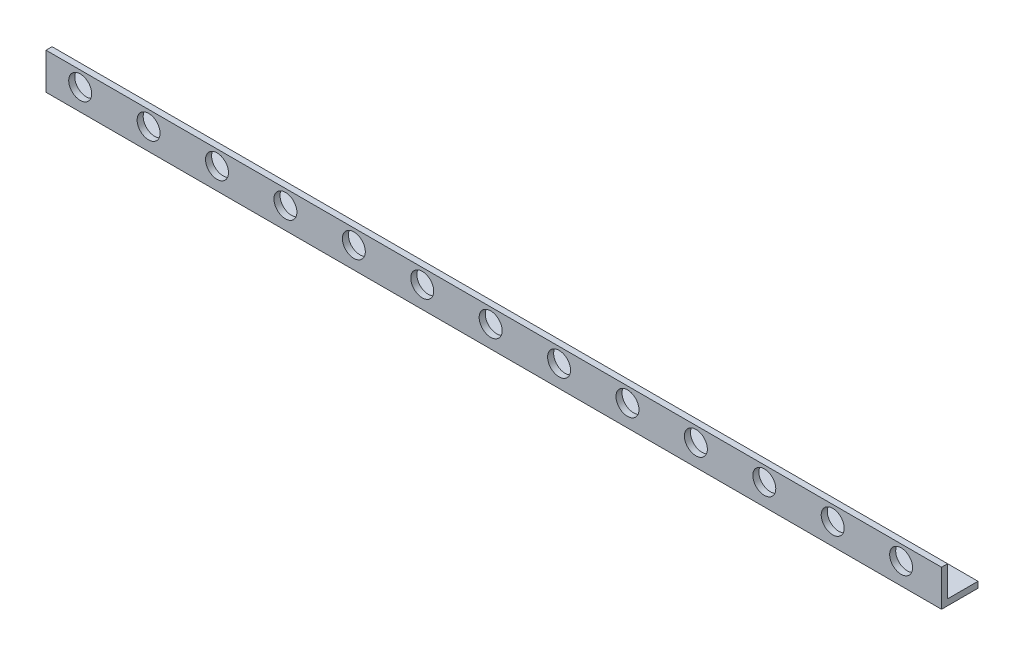
ISO-10303-21;
HEADER;
FILE_DESCRIPTION(('STEP AP214'),'2;1');
FILE_NAME('part.step','',(''),(''),'','','');
FILE_SCHEMA(('AUTOMOTIVE_DESIGN { 1 0 10303 214 1 1 1 1 }'));
ENDSEC;
DATA;
#1=APPLICATION_CONTEXT('core data for automotive mechanical design processes');
#2=APPLICATION_PROTOCOL_DEFINITION('international standard','automotive_design',2000,#1);
#3=PRODUCT_CONTEXT('',#1,'mechanical');
#4=PRODUCT('Part','Part','',(#3));
#5=PRODUCT_RELATED_PRODUCT_CATEGORY('part','',(#4));
#6=PRODUCT_DEFINITION_FORMATION('','',#4);
#7=PRODUCT_DEFINITION_CONTEXT('part definition',#1,'design');
#8=PRODUCT_DEFINITION('design','',#6,#7);
#9=PRODUCT_DEFINITION_SHAPE('','',#8);
#10=(LENGTH_UNIT() NAMED_UNIT(*) SI_UNIT(.MILLI.,.METRE.));
#11=(NAMED_UNIT(*) PLANE_ANGLE_UNIT() SI_UNIT($,.RADIAN.));
#12=(NAMED_UNIT(*) SI_UNIT($,.STERADIAN.) SOLID_ANGLE_UNIT());
#13=UNCERTAINTY_MEASURE_WITH_UNIT(LENGTH_MEASURE(1.E-05),#10,'distance_accuracy_value','');
#14=(GEOMETRIC_REPRESENTATION_CONTEXT(3) GLOBAL_UNCERTAINTY_ASSIGNED_CONTEXT((#13)) GLOBAL_UNIT_ASSIGNED_CONTEXT((#10,
#11,#12)) REPRESENTATION_CONTEXT('',''));
#15=CARTESIAN_POINT('',(0.,0.,0.));
#16=DIRECTION('',(0.,0.,1.));
#17=DIRECTION('',(1.,0.,0.));
#18=AXIS2_PLACEMENT_3D('',#15,#16,#17);
#19=CARTESIAN_POINT('',(-468.,0.,-19.05));
#20=DIRECTION('',(0.,-1.,0.));
#21=DIRECTION('',(0.,0.,-1.));
#22=AXIS2_PLACEMENT_3D('',#19,#20,#21);
#23=PLANE('',#22);
#24=DIRECTION('',(0.,0.,-1.));
#25=VECTOR('',#24,1.);
#26=CARTESIAN_POINT('',(0.,0.,-19.05));
#27=LINE('',#26,#25);
#28=CARTESIAN_POINT('',(0.,0.,0.));
#29=VERTEX_POINT('',#28);
#30=CARTESIAN_POINT('',(0.,0.,-19.05));
#31=VERTEX_POINT('',#30);
#32=EDGE_CURVE('E118',#29,#31,#27,.T.);
#33=ORIENTED_EDGE('',*,*,#32,.F.);
#34=DIRECTION('',(1.,0.,0.));
#35=VECTOR('',#34,1.);
#36=CARTESIAN_POINT('',(-468.,0.,0.));
#37=LINE('',#36,#35);
#38=CARTESIAN_POINT('',(-468.,0.,0.));
#39=VERTEX_POINT('',#38);
#40=EDGE_CURVE('E11',#39,#29,#37,.T.);
#41=ORIENTED_EDGE('',*,*,#40,.F.);
#42=DIRECTION('',(0.,0.,-1.));
#43=VECTOR('',#42,1.);
#44=CARTESIAN_POINT('',(-468.,0.,-19.05));
#45=LINE('',#44,#43);
#46=CARTESIAN_POINT('',(-468.,0.,-19.05));
#47=VERTEX_POINT('',#46);
#48=EDGE_CURVE('E133',#39,#47,#45,.T.);
#49=ORIENTED_EDGE('',*,*,#48,.T.);
#50=DIRECTION('',(1.,0.,0.));
#51=VECTOR('',#50,1.);
#52=CARTESIAN_POINT('',(-468.,0.,-19.05));
#53=LINE('',#52,#51);
#54=EDGE_CURVE('E36',#47,#31,#53,.T.);
#55=ORIENTED_EDGE('',*,*,#54,.T.);
#56=EDGE_LOOP('',(#33,#41,#49,#55));
#57=FACE_BOUND('',#56,.T.);
#58=ADVANCED_FACE('F33',(#57),#23,.T.);
#59=CARTESIAN_POINT('',(-468.,0.,0.));
#60=DIRECTION('',(0.,0.,1.));
#61=DIRECTION('',(1.,0.,0.));
#62=AXIS2_PLACEMENT_3D('',#59,#60,#61);
#63=PLANE('',#62);
#64=CARTESIAN_POINT('',(-21.13,11.2735467227539,0.));
#65=DIRECTION('',(0.,0.,1.));
#66=DIRECTION('',(1.,0.,0.));
#67=AXIS2_PLACEMENT_3D('',#64,#65,#66);
#68=CIRCLE('',#67,6.00000000000001);
#69=CARTESIAN_POINT('',(-15.13,11.2735467227539,0.));
#70=VERTEX_POINT('',#69);
#71=EDGE_CURVE('E227',#70,#70,#68,.T.);
#72=ORIENTED_EDGE('',*,*,#71,.F.);
#73=EDGE_LOOP('',(#72));
#74=FACE_BOUND('',#73,.T.);
#75=CARTESIAN_POINT('',(-56.88,11.2735467227539,0.));
#76=DIRECTION('',(0.,0.,1.));
#77=DIRECTION('',(1.,0.,0.));
#78=AXIS2_PLACEMENT_3D('',#75,#76,#77);
#79=CIRCLE('',#78,6.);
#80=CARTESIAN_POINT('',(-50.88,11.2735467227539,0.));
#81=VERTEX_POINT('',#80);
#82=EDGE_CURVE('E229',#81,#81,#79,.T.);
#83=ORIENTED_EDGE('',*,*,#82,.F.);
#84=EDGE_LOOP('',(#83));
#85=FACE_BOUND('',#84,.T.);
#86=CARTESIAN_POINT('',(-92.63,11.2735467227539,0.));
#87=DIRECTION('',(0.,0.,1.));
#88=DIRECTION('',(1.,0.,0.));
#89=AXIS2_PLACEMENT_3D('',#86,#87,#88);
#90=CIRCLE('',#89,6.);
#91=CARTESIAN_POINT('',(-86.63,11.2735467227539,0.));
#92=VERTEX_POINT('',#91);
#93=EDGE_CURVE('E235',#92,#92,#90,.T.);
#94=ORIENTED_EDGE('',*,*,#93,.F.);
#95=EDGE_LOOP('',(#94));
#96=FACE_BOUND('',#95,.T.);
#97=CARTESIAN_POINT('',(-128.38,11.2735467227539,0.));
#98=DIRECTION('',(0.,0.,1.));
#99=DIRECTION('',(1.,0.,0.));
#100=AXIS2_PLACEMENT_3D('',#97,#98,#99);
#101=CIRCLE('',#100,6.);
#102=CARTESIAN_POINT('',(-122.38,11.2735467227539,0.));
#103=VERTEX_POINT('',#102);
#104=EDGE_CURVE('E241',#103,#103,#101,.T.);
#105=ORIENTED_EDGE('',*,*,#104,.F.);
#106=EDGE_LOOP('',(#105));
#107=FACE_BOUND('',#106,.T.);
#108=CARTESIAN_POINT('',(-164.13,11.2735467227539,0.));
#109=DIRECTION('',(0.,0.,1.));
#110=DIRECTION('',(1.,0.,0.));
#111=AXIS2_PLACEMENT_3D('',#108,#109,#110);
#112=CIRCLE('',#111,6.00000000000002);
#113=CARTESIAN_POINT('',(-158.13,11.2735467227539,0.));
#114=VERTEX_POINT('',#113);
#115=EDGE_CURVE('E247',#114,#114,#112,.T.);
#116=ORIENTED_EDGE('',*,*,#115,.F.);
#117=EDGE_LOOP('',(#116));
#118=FACE_BOUND('',#117,.T.);
#119=CARTESIAN_POINT('',(-199.88,11.2735467227539,0.));
#120=DIRECTION('',(0.,0.,1.));
#121=DIRECTION('',(1.,0.,0.));
#122=AXIS2_PLACEMENT_3D('',#119,#120,#121);
#123=CIRCLE('',#122,5.99999999999999);
#124=CARTESIAN_POINT('',(-193.88,11.2735467227539,0.));
#125=VERTEX_POINT('',#124);
#126=EDGE_CURVE('E253',#125,#125,#123,.T.);
#127=ORIENTED_EDGE('',*,*,#126,.F.);
#128=EDGE_LOOP('',(#127));
#129=FACE_BOUND('',#128,.T.);
#130=CARTESIAN_POINT('',(-235.63,11.2735467227539,0.));
#131=DIRECTION('',(0.,0.,1.));
#132=DIRECTION('',(1.,0.,0.));
#133=AXIS2_PLACEMENT_3D('',#130,#131,#132);
#134=CIRCLE('',#133,5.99999999999996);
#135=CARTESIAN_POINT('',(-229.63,11.2735467227539,0.));
#136=VERTEX_POINT('',#135);
#137=EDGE_CURVE('E259',#136,#136,#134,.T.);
#138=ORIENTED_EDGE('',*,*,#137,.F.);
#139=EDGE_LOOP('',(#138));
#140=FACE_BOUND('',#139,.T.);
#141=CARTESIAN_POINT('',(-271.38,11.2735467227539,0.));
#142=DIRECTION('',(0.,0.,1.));
#143=DIRECTION('',(1.,0.,0.));
#144=AXIS2_PLACEMENT_3D('',#141,#142,#143);
#145=CIRCLE('',#144,5.99999999999993);
#146=CARTESIAN_POINT('',(-265.38,11.2735467227539,0.));
#147=VERTEX_POINT('',#146);
#148=EDGE_CURVE('E265',#147,#147,#145,.T.);
#149=ORIENTED_EDGE('',*,*,#148,.F.);
#150=EDGE_LOOP('',(#149));
#151=FACE_BOUND('',#150,.T.);
#152=CARTESIAN_POINT('',(-307.13,11.2735467227539,0.));
#153=DIRECTION('',(0.,0.,1.));
#154=DIRECTION('',(1.,0.,0.));
#155=AXIS2_PLACEMENT_3D('',#152,#153,#154);
#156=CIRCLE('',#155,5.99999999999999);
#157=CARTESIAN_POINT('',(-301.13,11.2735467227539,0.));
#158=VERTEX_POINT('',#157);
#159=EDGE_CURVE('E271',#158,#158,#156,.T.);
#160=ORIENTED_EDGE('',*,*,#159,.F.);
#161=EDGE_LOOP('',(#160));
#162=FACE_BOUND('',#161,.T.);
#163=CARTESIAN_POINT('',(-342.88,11.2735467227539,0.));
#164=DIRECTION('',(0.,0.,1.));
#165=DIRECTION('',(1.,0.,0.));
#166=AXIS2_PLACEMENT_3D('',#163,#164,#165);
#167=CIRCLE('',#166,5.99999999999999);
#168=CARTESIAN_POINT('',(-336.88,11.2735467227539,0.));
#169=VERTEX_POINT('',#168);
#170=EDGE_CURVE('E277',#169,#169,#167,.T.);
#171=ORIENTED_EDGE('',*,*,#170,.F.);
#172=EDGE_LOOP('',(#171));
#173=FACE_BOUND('',#172,.T.);
#174=CARTESIAN_POINT('',(-378.63,11.2735467227539,0.));
#175=DIRECTION('',(0.,0.,1.));
#176=DIRECTION('',(1.,0.,0.));
#177=AXIS2_PLACEMENT_3D('',#174,#175,#176);
#178=CIRCLE('',#177,6.00000000000005);
#179=CARTESIAN_POINT('',(-372.63,11.2735467227539,0.));
#180=VERTEX_POINT('',#179);
#181=EDGE_CURVE('E283',#180,#180,#178,.T.);
#182=ORIENTED_EDGE('',*,*,#181,.F.);
#183=EDGE_LOOP('',(#182));
#184=FACE_BOUND('',#183,.T.);
#185=CARTESIAN_POINT('',(-414.38,11.2735467227539,0.));
#186=DIRECTION('',(0.,0.,1.));
#187=DIRECTION('',(1.,0.,0.));
#188=AXIS2_PLACEMENT_3D('',#185,#186,#187);
#189=CIRCLE('',#188,5.99999999999999);
#190=CARTESIAN_POINT('',(-408.38,11.2735467227539,0.));
#191=VERTEX_POINT('',#190);
#192=EDGE_CURVE('E289',#191,#191,#189,.T.);
#193=ORIENTED_EDGE('',*,*,#192,.F.);
#194=EDGE_LOOP('',(#193));
#195=FACE_BOUND('',#194,.T.);
#196=CARTESIAN_POINT('',(-450.13,11.2735467227539,0.));
#197=DIRECTION('',(0.,0.,1.));
#198=DIRECTION('',(1.,0.,0.));
#199=AXIS2_PLACEMENT_3D('',#196,#197,#198);
#200=CIRCLE('',#199,5.99999999999999);
#201=CARTESIAN_POINT('',(-444.13,11.2735467227539,0.));
#202=VERTEX_POINT('',#201);
#203=EDGE_CURVE('E295',#202,#202,#200,.T.);
#204=ORIENTED_EDGE('',*,*,#203,.F.);
#205=EDGE_LOOP('',(#204));
#206=FACE_BOUND('',#205,.T.);
#207=DIRECTION('',(0.,-1.,0.));
#208=VECTOR('',#207,1.);
#209=CARTESIAN_POINT('',(0.,0.,0.));
#210=LINE('',#209,#208);
#211=CARTESIAN_POINT('',(0.,19.05,0.));
#212=VERTEX_POINT('',#211);
#213=EDGE_CURVE('E131',#212,#29,#210,.T.);
#214=ORIENTED_EDGE('',*,*,#213,.F.);
#215=DIRECTION('',(1.,0.,0.));
#216=VECTOR('',#215,1.);
#217=CARTESIAN_POINT('',(-468.,19.05,0.));
#218=LINE('',#217,#216);
#219=CARTESIAN_POINT('',(-468.,19.05,0.));
#220=VERTEX_POINT('',#219);
#221=EDGE_CURVE('E42',#220,#212,#218,.T.);
#222=ORIENTED_EDGE('',*,*,#221,.F.);
#223=DIRECTION('',(0.,-1.,0.));
#224=VECTOR('',#223,1.);
#225=CARTESIAN_POINT('',(-468.,0.,0.));
#226=LINE('',#225,#224);
#227=EDGE_CURVE('E108',#220,#39,#226,.T.);
#228=ORIENTED_EDGE('',*,*,#227,.T.);
#229=ORIENTED_EDGE('',*,*,#40,.T.);
#230=EDGE_LOOP('',(#214,#222,#228,#229));
#231=FACE_BOUND('',#230,.T.);
#232=ADVANCED_FACE('F141',(#74,#85,#96,#107,#118,#129,#140,#151,#162,#173,#184,#195,#206,#231),
#63,.T.);
#233=CARTESIAN_POINT('',(-468.,19.05,0.));
#234=DIRECTION('',(0.,1.,0.));
#235=DIRECTION('',(0.,0.,1.));
#236=AXIS2_PLACEMENT_3D('',#233,#234,#235);
#237=PLANE('',#236);
#238=DIRECTION('',(0.,0.,1.));
#239=VECTOR('',#238,1.);
#240=CARTESIAN_POINT('',(0.,19.05,0.));
#241=LINE('',#240,#239);
#242=CARTESIAN_POINT('',(0.,19.05,-3.175));
#243=VERTEX_POINT('',#242);
#244=EDGE_CURVE('E95',#243,#212,#241,.T.);
#245=ORIENTED_EDGE('',*,*,#244,.F.);
#246=DIRECTION('',(1.,0.,0.));
#247=VECTOR('',#246,1.);
#248=CARTESIAN_POINT('',(-468.,19.05,-3.175));
#249=LINE('',#248,#247);
#250=CARTESIAN_POINT('',(-468.,19.05,-3.175));
#251=VERTEX_POINT('',#250);
#252=EDGE_CURVE('E90',#251,#243,#249,.T.);
#253=ORIENTED_EDGE('',*,*,#252,.F.);
#254=DIRECTION('',(0.,0.,1.));
#255=VECTOR('',#254,1.);
#256=CARTESIAN_POINT('',(-468.,19.05,0.));
#257=LINE('',#256,#255);
#258=EDGE_CURVE('E93',#251,#220,#257,.T.);
#259=ORIENTED_EDGE('',*,*,#258,.T.);
#260=ORIENTED_EDGE('',*,*,#221,.T.);
#261=EDGE_LOOP('',(#245,#253,#259,#260));
#262=FACE_BOUND('',#261,.T.);
#263=ADVANCED_FACE('F92',(#262),#237,.T.);
#264=CARTESIAN_POINT('',(-468.,19.05,-3.175));
#265=DIRECTION('',(0.,0.,-1.));
#266=DIRECTION('',(0.,1.,0.));
#267=AXIS2_PLACEMENT_3D('',#264,#265,#266);
#268=PLANE('',#267);
#269=CARTESIAN_POINT('',(-21.13,11.2735467227539,-3.175));
#270=DIRECTION('',(0.,0.,1.));
#271=DIRECTION('',(1.,0.,0.));
#272=AXIS2_PLACEMENT_3D('',#269,#270,#271);
#273=CIRCLE('',#272,6.00000000000001);
#274=CARTESIAN_POINT('',(-15.13,11.2735467227539,-3.175));
#275=VERTEX_POINT('',#274);
#276=EDGE_CURVE('E225',#275,#275,#273,.T.);
#277=ORIENTED_EDGE('',*,*,#276,.T.);
#278=EDGE_LOOP('',(#277));
#279=FACE_BOUND('',#278,.T.);
#280=CARTESIAN_POINT('',(-56.88,11.2735467227539,-3.175));
#281=DIRECTION('',(0.,0.,1.));
#282=DIRECTION('',(1.,0.,0.));
#283=AXIS2_PLACEMENT_3D('',#280,#281,#282);
#284=CIRCLE('',#283,6.);
#285=CARTESIAN_POINT('',(-50.88,11.2735467227539,-3.175));
#286=VERTEX_POINT('',#285);
#287=EDGE_CURVE('E232',#286,#286,#284,.T.);
#288=ORIENTED_EDGE('',*,*,#287,.T.);
#289=EDGE_LOOP('',(#288));
#290=FACE_BOUND('',#289,.T.);
#291=CARTESIAN_POINT('',(-92.63,11.2735467227539,-3.175));
#292=DIRECTION('',(0.,0.,1.));
#293=DIRECTION('',(1.,0.,0.));
#294=AXIS2_PLACEMENT_3D('',#291,#292,#293);
#295=CIRCLE('',#294,6.);
#296=CARTESIAN_POINT('',(-86.63,11.2735467227539,-3.175));
#297=VERTEX_POINT('',#296);
#298=EDGE_CURVE('E238',#297,#297,#295,.T.);
#299=ORIENTED_EDGE('',*,*,#298,.T.);
#300=EDGE_LOOP('',(#299));
#301=FACE_BOUND('',#300,.T.);
#302=CARTESIAN_POINT('',(-128.38,11.2735467227539,-3.175));
#303=DIRECTION('',(0.,0.,1.));
#304=DIRECTION('',(1.,0.,0.));
#305=AXIS2_PLACEMENT_3D('',#302,#303,#304);
#306=CIRCLE('',#305,6.);
#307=CARTESIAN_POINT('',(-122.38,11.2735467227539,-3.175));
#308=VERTEX_POINT('',#307);
#309=EDGE_CURVE('E244',#308,#308,#306,.T.);
#310=ORIENTED_EDGE('',*,*,#309,.T.);
#311=EDGE_LOOP('',(#310));
#312=FACE_BOUND('',#311,.T.);
#313=CARTESIAN_POINT('',(-164.13,11.2735467227539,-3.175));
#314=DIRECTION('',(0.,0.,1.));
#315=DIRECTION('',(1.,0.,0.));
#316=AXIS2_PLACEMENT_3D('',#313,#314,#315);
#317=CIRCLE('',#316,6.00000000000002);
#318=CARTESIAN_POINT('',(-158.13,11.2735467227539,-3.175));
#319=VERTEX_POINT('',#318);
#320=EDGE_CURVE('E250',#319,#319,#317,.T.);
#321=ORIENTED_EDGE('',*,*,#320,.T.);
#322=EDGE_LOOP('',(#321));
#323=FACE_BOUND('',#322,.T.);
#324=CARTESIAN_POINT('',(-199.88,11.2735467227539,-3.175));
#325=DIRECTION('',(0.,0.,1.));
#326=DIRECTION('',(1.,0.,0.));
#327=AXIS2_PLACEMENT_3D('',#324,#325,#326);
#328=CIRCLE('',#327,5.99999999999999);
#329=CARTESIAN_POINT('',(-193.88,11.2735467227539,-3.175));
#330=VERTEX_POINT('',#329);
#331=EDGE_CURVE('E256',#330,#330,#328,.T.);
#332=ORIENTED_EDGE('',*,*,#331,.T.);
#333=EDGE_LOOP('',(#332));
#334=FACE_BOUND('',#333,.T.);
#335=CARTESIAN_POINT('',(-235.63,11.2735467227539,-3.175));
#336=DIRECTION('',(0.,0.,1.));
#337=DIRECTION('',(1.,0.,0.));
#338=AXIS2_PLACEMENT_3D('',#335,#336,#337);
#339=CIRCLE('',#338,5.99999999999996);
#340=CARTESIAN_POINT('',(-229.63,11.2735467227539,-3.175));
#341=VERTEX_POINT('',#340);
#342=EDGE_CURVE('E262',#341,#341,#339,.T.);
#343=ORIENTED_EDGE('',*,*,#342,.T.);
#344=EDGE_LOOP('',(#343));
#345=FACE_BOUND('',#344,.T.);
#346=CARTESIAN_POINT('',(-271.38,11.2735467227539,-3.175));
#347=DIRECTION('',(0.,0.,1.));
#348=DIRECTION('',(1.,0.,0.));
#349=AXIS2_PLACEMENT_3D('',#346,#347,#348);
#350=CIRCLE('',#349,5.99999999999993);
#351=CARTESIAN_POINT('',(-265.38,11.2735467227539,-3.175));
#352=VERTEX_POINT('',#351);
#353=EDGE_CURVE('E268',#352,#352,#350,.T.);
#354=ORIENTED_EDGE('',*,*,#353,.T.);
#355=EDGE_LOOP('',(#354));
#356=FACE_BOUND('',#355,.T.);
#357=CARTESIAN_POINT('',(-307.13,11.2735467227539,-3.175));
#358=DIRECTION('',(0.,0.,1.));
#359=DIRECTION('',(1.,0.,0.));
#360=AXIS2_PLACEMENT_3D('',#357,#358,#359);
#361=CIRCLE('',#360,5.99999999999999);
#362=CARTESIAN_POINT('',(-301.13,11.2735467227539,-3.175));
#363=VERTEX_POINT('',#362);
#364=EDGE_CURVE('E274',#363,#363,#361,.T.);
#365=ORIENTED_EDGE('',*,*,#364,.T.);
#366=EDGE_LOOP('',(#365));
#367=FACE_BOUND('',#366,.T.);
#368=CARTESIAN_POINT('',(-342.88,11.2735467227539,-3.175));
#369=DIRECTION('',(0.,0.,1.));
#370=DIRECTION('',(1.,0.,0.));
#371=AXIS2_PLACEMENT_3D('',#368,#369,#370);
#372=CIRCLE('',#371,5.99999999999999);
#373=CARTESIAN_POINT('',(-336.88,11.2735467227539,-3.175));
#374=VERTEX_POINT('',#373);
#375=EDGE_CURVE('E280',#374,#374,#372,.T.);
#376=ORIENTED_EDGE('',*,*,#375,.T.);
#377=EDGE_LOOP('',(#376));
#378=FACE_BOUND('',#377,.T.);
#379=CARTESIAN_POINT('',(-378.63,11.2735467227539,-3.175));
#380=DIRECTION('',(0.,0.,1.));
#381=DIRECTION('',(1.,0.,0.));
#382=AXIS2_PLACEMENT_3D('',#379,#380,#381);
#383=CIRCLE('',#382,6.00000000000005);
#384=CARTESIAN_POINT('',(-372.63,11.2735467227539,-3.175));
#385=VERTEX_POINT('',#384);
#386=EDGE_CURVE('E286',#385,#385,#383,.T.);
#387=ORIENTED_EDGE('',*,*,#386,.T.);
#388=EDGE_LOOP('',(#387));
#389=FACE_BOUND('',#388,.T.);
#390=CARTESIAN_POINT('',(-414.38,11.2735467227539,-3.175));
#391=DIRECTION('',(0.,0.,1.));
#392=DIRECTION('',(1.,0.,0.));
#393=AXIS2_PLACEMENT_3D('',#390,#391,#392);
#394=CIRCLE('',#393,5.99999999999999);
#395=CARTESIAN_POINT('',(-408.38,11.2735467227539,-3.175));
#396=VERTEX_POINT('',#395);
#397=EDGE_CURVE('E292',#396,#396,#394,.T.);
#398=ORIENTED_EDGE('',*,*,#397,.T.);
#399=EDGE_LOOP('',(#398));
#400=FACE_BOUND('',#399,.T.);
#401=CARTESIAN_POINT('',(-450.13,11.2735467227539,-3.175));
#402=DIRECTION('',(0.,0.,1.));
#403=DIRECTION('',(1.,0.,0.));
#404=AXIS2_PLACEMENT_3D('',#401,#402,#403);
#405=CIRCLE('',#404,5.99999999999999);
#406=CARTESIAN_POINT('',(-444.13,11.2735467227539,-3.175));
#407=VERTEX_POINT('',#406);
#408=EDGE_CURVE('E122',#407,#407,#405,.T.);
#409=ORIENTED_EDGE('',*,*,#408,.T.);
#410=EDGE_LOOP('',(#409));
#411=FACE_BOUND('',#410,.T.);
#412=DIRECTION('',(0.,1.,0.));
#413=VECTOR('',#412,1.);
#414=CARTESIAN_POINT('',(0.,19.05,-3.175));
#415=LINE('',#414,#413);
#416=CARTESIAN_POINT('',(0.,3.175,-3.175));
#417=VERTEX_POINT('',#416);
#418=EDGE_CURVE('E128',#417,#243,#415,.T.);
#419=ORIENTED_EDGE('',*,*,#418,.F.);
#420=DIRECTION('',(1.,0.,0.));
#421=VECTOR('',#420,1.);
#422=CARTESIAN_POINT('',(-468.,3.175,-3.175));
#423=LINE('',#422,#421);
#424=CARTESIAN_POINT('',(-468.,3.175,-3.175));
#425=VERTEX_POINT('',#424);
#426=EDGE_CURVE('E100',#425,#417,#423,.T.);
#427=ORIENTED_EDGE('',*,*,#426,.F.);
#428=DIRECTION('',(0.,1.,0.));
#429=VECTOR('',#428,1.);
#430=CARTESIAN_POINT('',(-468.,19.05,-3.175));
#431=LINE('',#430,#429);
#432=EDGE_CURVE('E106',#425,#251,#431,.T.);
#433=ORIENTED_EDGE('',*,*,#432,.T.);
#434=ORIENTED_EDGE('',*,*,#252,.T.);
#435=EDGE_LOOP('',(#419,#427,#433,#434));
#436=FACE_BOUND('',#435,.T.);
#437=ADVANCED_FACE('F110',(#279,#290,#301,#312,#323,#334,#345,#356,#367,#378,#389,#400,#411,
#436),#268,.T.);
#438=CARTESIAN_POINT('',(-468.,3.175,-3.175));
#439=DIRECTION('',(0.,1.,0.));
#440=DIRECTION('',(0.,0.,1.));
#441=AXIS2_PLACEMENT_3D('',#438,#439,#440);
#442=PLANE('',#441);
#443=DIRECTION('',(0.,0.,1.));
#444=VECTOR('',#443,1.);
#445=CARTESIAN_POINT('',(0.,3.175,-3.175));
#446=LINE('',#445,#444);
#447=CARTESIAN_POINT('',(0.,3.175,-19.05));
#448=VERTEX_POINT('',#447);
#449=EDGE_CURVE('E125',#448,#417,#446,.T.);
#450=ORIENTED_EDGE('',*,*,#449,.F.);
#451=DIRECTION('',(1.,0.,0.));
#452=VECTOR('',#451,1.);
#453=CARTESIAN_POINT('',(-468.,3.175,-19.05));
#454=LINE('',#453,#452);
#455=CARTESIAN_POINT('',(-468.,3.175,-19.05));
#456=VERTEX_POINT('',#455);
#457=EDGE_CURVE('E136',#456,#448,#454,.T.);
#458=ORIENTED_EDGE('',*,*,#457,.F.);
#459=DIRECTION('',(0.,0.,1.));
#460=VECTOR('',#459,1.);
#461=CARTESIAN_POINT('',(-468.,3.175,-3.175));
#462=LINE('',#461,#460);
#463=EDGE_CURVE('E111',#456,#425,#462,.T.);
#464=ORIENTED_EDGE('',*,*,#463,.T.);
#465=ORIENTED_EDGE('',*,*,#426,.T.);
#466=EDGE_LOOP('',(#450,#458,#464,#465));
#467=FACE_BOUND('',#466,.T.);
#468=ADVANCED_FACE('F157',(#467),#442,.T.);
#469=CARTESIAN_POINT('',(-468.,3.175,-19.05));
#470=DIRECTION('',(0.,0.,-1.));
#471=DIRECTION('',(0.,1.,0.));
#472=AXIS2_PLACEMENT_3D('',#469,#470,#471);
#473=PLANE('',#472);
#474=DIRECTION('',(0.,1.,0.));
#475=VECTOR('',#474,1.);
#476=CARTESIAN_POINT('',(0.,3.175,-19.05));
#477=LINE('',#476,#475);
#478=EDGE_CURVE('E121',#31,#448,#477,.T.);
#479=ORIENTED_EDGE('',*,*,#478,.F.);
#480=ORIENTED_EDGE('',*,*,#54,.F.);
#481=DIRECTION('',(0.,1.,0.));
#482=VECTOR('',#481,1.);
#483=CARTESIAN_POINT('',(-468.,3.175,-19.05));
#484=LINE('',#483,#482);
#485=EDGE_CURVE('E113',#47,#456,#484,.T.);
#486=ORIENTED_EDGE('',*,*,#485,.T.);
#487=ORIENTED_EDGE('',*,*,#457,.T.);
#488=EDGE_LOOP('',(#479,#480,#486,#487));
#489=FACE_BOUND('',#488,.T.);
#490=ADVANCED_FACE('F138',(#489),#473,.T.);
#491=CARTESIAN_POINT('',(-468.,0.,0.));
#492=DIRECTION('',(-1.,0.,0.));
#493=DIRECTION('',(0.,0.,1.));
#494=AXIS2_PLACEMENT_3D('',#491,#492,#493);
#495=PLANE('',#494);
#496=ORIENTED_EDGE('',*,*,#48,.F.);
#497=ORIENTED_EDGE('',*,*,#227,.F.);
#498=ORIENTED_EDGE('',*,*,#258,.F.);
#499=ORIENTED_EDGE('',*,*,#432,.F.);
#500=ORIENTED_EDGE('',*,*,#463,.F.);
#501=ORIENTED_EDGE('',*,*,#485,.F.);
#502=EDGE_LOOP('',(#496,#497,#498,#499,#500,#501));
#503=FACE_BOUND('',#502,.T.);
#504=ADVANCED_FACE('F104',(#503),#495,.T.);
#505=CARTESIAN_POINT('',(0.,0.,0.));
#506=DIRECTION('',(-1.,0.,0.));
#507=DIRECTION('',(0.,0.,1.));
#508=AXIS2_PLACEMENT_3D('',#505,#506,#507);
#509=PLANE('',#508);
#510=ORIENTED_EDGE('',*,*,#32,.T.);
#511=ORIENTED_EDGE('',*,*,#478,.T.);
#512=ORIENTED_EDGE('',*,*,#449,.T.);
#513=ORIENTED_EDGE('',*,*,#418,.T.);
#514=ORIENTED_EDGE('',*,*,#244,.T.);
#515=ORIENTED_EDGE('',*,*,#213,.T.);
#516=EDGE_LOOP('',(#510,#511,#512,#513,#514,#515));
#517=FACE_BOUND('',#516,.T.);
#518=ADVANCED_FACE('F140',(#517),#509,.F.);
#519=CARTESIAN_POINT('',(-450.13,11.2735467227539,-3.175));
#520=DIRECTION('',(0.,0.,1.));
#521=DIRECTION('',(1.,0.,0.));
#522=AXIS2_PLACEMENT_3D('',#519,#520,#521);
#523=CYLINDRICAL_SURFACE('',#522,5.99999999999999);
#524=ORIENTED_EDGE('',*,*,#408,.F.);
#525=EDGE_LOOP('',(#524));
#526=FACE_BOUND('',#525,.T.);
#527=ORIENTED_EDGE('',*,*,#203,.T.);
#528=EDGE_LOOP('',(#527));
#529=FACE_BOUND('',#528,.T.);
#530=ADVANCED_FACE('F168',(#526,#529),#523,.F.);
#531=CARTESIAN_POINT('',(-414.38,11.2735467227539,-3.175));
#532=DIRECTION('',(0.,0.,1.));
#533=DIRECTION('',(1.,0.,0.));
#534=AXIS2_PLACEMENT_3D('',#531,#532,#533);
#535=CYLINDRICAL_SURFACE('',#534,5.99999999999999);
#536=ORIENTED_EDGE('',*,*,#397,.F.);
#537=EDGE_LOOP('',(#536));
#538=FACE_BOUND('',#537,.T.);
#539=ORIENTED_EDGE('',*,*,#192,.T.);
#540=EDGE_LOOP('',(#539));
#541=FACE_BOUND('',#540,.T.);
#542=ADVANCED_FACE('F172',(#538,#541),#535,.F.);
#543=CARTESIAN_POINT('',(-378.63,11.2735467227539,-3.175));
#544=DIRECTION('',(0.,0.,1.));
#545=DIRECTION('',(1.,0.,0.));
#546=AXIS2_PLACEMENT_3D('',#543,#544,#545);
#547=CYLINDRICAL_SURFACE('',#546,6.00000000000005);
#548=ORIENTED_EDGE('',*,*,#386,.F.);
#549=EDGE_LOOP('',(#548));
#550=FACE_BOUND('',#549,.T.);
#551=ORIENTED_EDGE('',*,*,#181,.T.);
#552=EDGE_LOOP('',(#551));
#553=FACE_BOUND('',#552,.T.);
#554=ADVANCED_FACE('F176',(#550,#553),#547,.F.);
#555=CARTESIAN_POINT('',(-342.88,11.2735467227539,-3.175));
#556=DIRECTION('',(0.,0.,1.));
#557=DIRECTION('',(1.,0.,0.));
#558=AXIS2_PLACEMENT_3D('',#555,#556,#557);
#559=CYLINDRICAL_SURFACE('',#558,5.99999999999999);
#560=ORIENTED_EDGE('',*,*,#375,.F.);
#561=EDGE_LOOP('',(#560));
#562=FACE_BOUND('',#561,.T.);
#563=ORIENTED_EDGE('',*,*,#170,.T.);
#564=EDGE_LOOP('',(#563));
#565=FACE_BOUND('',#564,.T.);
#566=ADVANCED_FACE('F180',(#562,#565),#559,.F.);
#567=CARTESIAN_POINT('',(-307.13,11.2735467227539,-3.175));
#568=DIRECTION('',(0.,0.,1.));
#569=DIRECTION('',(1.,0.,0.));
#570=AXIS2_PLACEMENT_3D('',#567,#568,#569);
#571=CYLINDRICAL_SURFACE('',#570,5.99999999999999);
#572=ORIENTED_EDGE('',*,*,#364,.F.);
#573=EDGE_LOOP('',(#572));
#574=FACE_BOUND('',#573,.T.);
#575=ORIENTED_EDGE('',*,*,#159,.T.);
#576=EDGE_LOOP('',(#575));
#577=FACE_BOUND('',#576,.T.);
#578=ADVANCED_FACE('F184',(#574,#577),#571,.F.);
#579=CARTESIAN_POINT('',(-271.38,11.2735467227539,-3.175));
#580=DIRECTION('',(0.,0.,1.));
#581=DIRECTION('',(1.,0.,0.));
#582=AXIS2_PLACEMENT_3D('',#579,#580,#581);
#583=CYLINDRICAL_SURFACE('',#582,5.99999999999993);
#584=ORIENTED_EDGE('',*,*,#353,.F.);
#585=EDGE_LOOP('',(#584));
#586=FACE_BOUND('',#585,.T.);
#587=ORIENTED_EDGE('',*,*,#148,.T.);
#588=EDGE_LOOP('',(#587));
#589=FACE_BOUND('',#588,.T.);
#590=ADVANCED_FACE('F188',(#586,#589),#583,.F.);
#591=CARTESIAN_POINT('',(-235.63,11.2735467227539,-3.175));
#592=DIRECTION('',(0.,0.,1.));
#593=DIRECTION('',(1.,0.,0.));
#594=AXIS2_PLACEMENT_3D('',#591,#592,#593);
#595=CYLINDRICAL_SURFACE('',#594,5.99999999999996);
#596=ORIENTED_EDGE('',*,*,#342,.F.);
#597=EDGE_LOOP('',(#596));
#598=FACE_BOUND('',#597,.T.);
#599=ORIENTED_EDGE('',*,*,#137,.T.);
#600=EDGE_LOOP('',(#599));
#601=FACE_BOUND('',#600,.T.);
#602=ADVANCED_FACE('F192',(#598,#601),#595,.F.);
#603=CARTESIAN_POINT('',(-199.88,11.2735467227539,-3.175));
#604=DIRECTION('',(0.,0.,1.));
#605=DIRECTION('',(1.,0.,0.));
#606=AXIS2_PLACEMENT_3D('',#603,#604,#605);
#607=CYLINDRICAL_SURFACE('',#606,5.99999999999999);
#608=ORIENTED_EDGE('',*,*,#331,.F.);
#609=EDGE_LOOP('',(#608));
#610=FACE_BOUND('',#609,.T.);
#611=ORIENTED_EDGE('',*,*,#126,.T.);
#612=EDGE_LOOP('',(#611));
#613=FACE_BOUND('',#612,.T.);
#614=ADVANCED_FACE('F196',(#610,#613),#607,.F.);
#615=CARTESIAN_POINT('',(-164.13,11.2735467227539,-3.175));
#616=DIRECTION('',(0.,0.,1.));
#617=DIRECTION('',(1.,0.,0.));
#618=AXIS2_PLACEMENT_3D('',#615,#616,#617);
#619=CYLINDRICAL_SURFACE('',#618,6.00000000000002);
#620=ORIENTED_EDGE('',*,*,#320,.F.);
#621=EDGE_LOOP('',(#620));
#622=FACE_BOUND('',#621,.T.);
#623=ORIENTED_EDGE('',*,*,#115,.T.);
#624=EDGE_LOOP('',(#623));
#625=FACE_BOUND('',#624,.T.);
#626=ADVANCED_FACE('F200',(#622,#625),#619,.F.);
#627=CARTESIAN_POINT('',(-128.38,11.2735467227539,-3.175));
#628=DIRECTION('',(0.,0.,1.));
#629=DIRECTION('',(1.,0.,0.));
#630=AXIS2_PLACEMENT_3D('',#627,#628,#629);
#631=CYLINDRICAL_SURFACE('',#630,6.);
#632=ORIENTED_EDGE('',*,*,#309,.F.);
#633=EDGE_LOOP('',(#632));
#634=FACE_BOUND('',#633,.T.);
#635=ORIENTED_EDGE('',*,*,#104,.T.);
#636=EDGE_LOOP('',(#635));
#637=FACE_BOUND('',#636,.T.);
#638=ADVANCED_FACE('F204',(#634,#637),#631,.F.);
#639=CARTESIAN_POINT('',(-92.63,11.2735467227539,-3.175));
#640=DIRECTION('',(0.,0.,1.));
#641=DIRECTION('',(1.,0.,0.));
#642=AXIS2_PLACEMENT_3D('',#639,#640,#641);
#643=CYLINDRICAL_SURFACE('',#642,6.);
#644=ORIENTED_EDGE('',*,*,#298,.F.);
#645=EDGE_LOOP('',(#644));
#646=FACE_BOUND('',#645,.T.);
#647=ORIENTED_EDGE('',*,*,#93,.T.);
#648=EDGE_LOOP('',(#647));
#649=FACE_BOUND('',#648,.T.);
#650=ADVANCED_FACE('F208',(#646,#649),#643,.F.);
#651=CARTESIAN_POINT('',(-56.88,11.2735467227539,-3.175));
#652=DIRECTION('',(0.,0.,1.));
#653=DIRECTION('',(1.,0.,0.));
#654=AXIS2_PLACEMENT_3D('',#651,#652,#653);
#655=CYLINDRICAL_SURFACE('',#654,6.);
#656=ORIENTED_EDGE('',*,*,#287,.F.);
#657=EDGE_LOOP('',(#656));
#658=FACE_BOUND('',#657,.T.);
#659=ORIENTED_EDGE('',*,*,#82,.T.);
#660=EDGE_LOOP('',(#659));
#661=FACE_BOUND('',#660,.T.);
#662=ADVANCED_FACE('F212',(#658,#661),#655,.F.);
#663=CARTESIAN_POINT('',(-21.13,11.2735467227539,-3.175));
#664=DIRECTION('',(0.,0.,1.));
#665=DIRECTION('',(1.,0.,0.));
#666=AXIS2_PLACEMENT_3D('',#663,#664,#665);
#667=CYLINDRICAL_SURFACE('',#666,6.00000000000001);
#668=ORIENTED_EDGE('',*,*,#276,.F.);
#669=EDGE_LOOP('',(#668));
#670=FACE_BOUND('',#669,.T.);
#671=ORIENTED_EDGE('',*,*,#71,.T.);
#672=EDGE_LOOP('',(#671));
#673=FACE_BOUND('',#672,.T.);
#674=ADVANCED_FACE('F216',(#670,#673),#667,.F.);
#675=CLOSED_SHELL('',(#58,#232,#263,#437,#468,#490,#504,#518,#530,#542,#554,#566,#578,#590,#602,
#614,#626,#638,#650,#662,#674));
#676=MANIFOLD_SOLID_BREP('B2',#675);
#677=ADVANCED_BREP_SHAPE_REPRESENTATION('',(#18,#676),#14);
#678=SHAPE_DEFINITION_REPRESENTATION(#9,#677);
ENDSEC;
END-ISO-10303-21;
